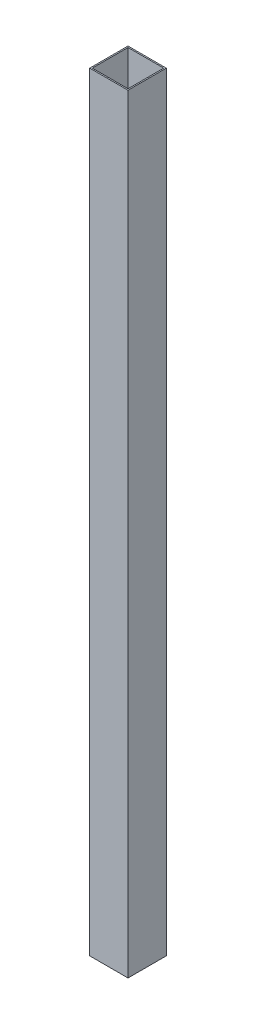
ISO-10303-21;
HEADER;
FILE_DESCRIPTION(('STEP AP214'),'2;1');
FILE_NAME('part.step','',(''),(''),'','','');
FILE_SCHEMA(('AUTOMOTIVE_DESIGN { 1 0 10303 214 1 1 1 1 }'));
ENDSEC;
DATA;
#1=APPLICATION_CONTEXT('core data for automotive mechanical design processes');
#2=APPLICATION_PROTOCOL_DEFINITION('international standard','automotive_design',2000,#1);
#3=PRODUCT_CONTEXT('',#1,'mechanical');
#4=PRODUCT('Part','Part','',(#3));
#5=PRODUCT_RELATED_PRODUCT_CATEGORY('part','',(#4));
#6=PRODUCT_DEFINITION_FORMATION('','',#4);
#7=PRODUCT_DEFINITION_CONTEXT('part definition',#1,'design');
#8=PRODUCT_DEFINITION('design','',#6,#7);
#9=PRODUCT_DEFINITION_SHAPE('','',#8);
#10=(LENGTH_UNIT() NAMED_UNIT(*) SI_UNIT(.MILLI.,.METRE.));
#11=(NAMED_UNIT(*) PLANE_ANGLE_UNIT() SI_UNIT($,.RADIAN.));
#12=(NAMED_UNIT(*) SI_UNIT($,.STERADIAN.) SOLID_ANGLE_UNIT());
#13=UNCERTAINTY_MEASURE_WITH_UNIT(LENGTH_MEASURE(1.E-05),#10,'distance_accuracy_value','');
#14=(GEOMETRIC_REPRESENTATION_CONTEXT(3) GLOBAL_UNCERTAINTY_ASSIGNED_CONTEXT((#13)) GLOBAL_UNIT_ASSIGNED_CONTEXT((#10,
#11,#12)) REPRESENTATION_CONTEXT('',''));
#15=CARTESIAN_POINT('',(0.,0.,0.));
#16=DIRECTION('',(0.,0.,1.));
#17=DIRECTION('',(1.,0.,0.));
#18=AXIS2_PLACEMENT_3D('',#15,#16,#17);
#19=CARTESIAN_POINT('',(1310.,7180.,150.000000000003));
#20=DIRECTION('',(1.,0.,0.));
#21=DIRECTION('',(0.,0.,-1.));
#22=AXIS2_PLACEMENT_3D('',#19,#20,#21);
#23=PLANE('',#22);
#24=DIRECTION('',(0.,-1.,0.));
#25=VECTOR('',#24,1.);
#26=CARTESIAN_POINT('',(1310.,8130.,150.));
#27=LINE('',#26,#25);
#28=CARTESIAN_POINT('',(1310.,8130.,150.));
#29=VERTEX_POINT('',#28);
#30=CARTESIAN_POINT('',(1310.,2107.5,150.));
#31=VERTEX_POINT('',#30);
#32=EDGE_CURVE('E101',#29,#31,#27,.T.);
#33=ORIENTED_EDGE('',*,*,#32,.T.);
#34=DIRECTION('',(0.,0.,1.));
#35=VECTOR('',#34,1.);
#36=CARTESIAN_POINT('',(1310.,2107.5,150.));
#37=LINE('',#36,#35);
#38=CARTESIAN_POINT('',(1310.,2107.5,-150.));
#39=VERTEX_POINT('',#38);
#40=EDGE_CURVE('E103',#39,#31,#37,.T.);
#41=ORIENTED_EDGE('',*,*,#40,.F.);
#42=DIRECTION('',(0.,-1.,0.));
#43=VECTOR('',#42,1.);
#44=CARTESIAN_POINT('',(1310.,8130.,-150.));
#45=LINE('',#44,#43);
#46=CARTESIAN_POINT('',(1310.,8130.,-150.));
#47=VERTEX_POINT('',#46);
#48=EDGE_CURVE('E110',#47,#39,#45,.T.);
#49=ORIENTED_EDGE('',*,*,#48,.F.);
#50=DIRECTION('',(0.,0.,1.));
#51=VECTOR('',#50,1.);
#52=CARTESIAN_POINT('',(1310.,8130.,150.));
#53=LINE('',#52,#51);
#54=EDGE_CURVE('E106',#47,#29,#53,.T.);
#55=ORIENTED_EDGE('',*,*,#54,.T.);
#56=EDGE_LOOP('',(#33,#41,#49,#55));
#57=FACE_BOUND('',#56,.T.);
#58=ADVANCED_FACE('F34',(#57),#23,.T.);
#59=CARTESIAN_POINT('',(1010.,2107.5,150.));
#60=DIRECTION('',(0.,1.,0.));
#61=DIRECTION('',(0.,0.,1.));
#62=AXIS2_PLACEMENT_3D('',#59,#60,#61);
#63=PLANE('',#62);
#64=DIRECTION('',(-1.,0.,0.));
#65=VECTOR('',#64,1.);
#66=CARTESIAN_POINT('',(1020.,2107.5,140.));
#67=LINE('',#66,#65);
#68=CARTESIAN_POINT('',(1300.,2107.5,140.));
#69=VERTEX_POINT('',#68);
#70=CARTESIAN_POINT('',(1020.,2107.5,140.));
#71=VERTEX_POINT('',#70);
#72=EDGE_CURVE('E160',#69,#71,#67,.T.);
#73=ORIENTED_EDGE('',*,*,#72,.F.);
#74=DIRECTION('',(0.,0.,1.));
#75=VECTOR('',#74,1.);
#76=CARTESIAN_POINT('',(1300.,2107.5,140.));
#77=LINE('',#76,#75);
#78=CARTESIAN_POINT('',(1300.,2107.5,-140.));
#79=VERTEX_POINT('',#78);
#80=EDGE_CURVE('E59',#79,#69,#77,.T.);
#81=ORIENTED_EDGE('',*,*,#80,.F.);
#82=DIRECTION('',(1.,0.,0.));
#83=VECTOR('',#82,1.);
#84=CARTESIAN_POINT('',(1020.,2107.5,-140.));
#85=LINE('',#84,#83);
#86=CARTESIAN_POINT('',(1020.,2107.5,-140.));
#87=VERTEX_POINT('',#86);
#88=EDGE_CURVE('E164',#87,#79,#85,.T.);
#89=ORIENTED_EDGE('',*,*,#88,.F.);
#90=DIRECTION('',(0.,0.,-1.));
#91=VECTOR('',#90,1.);
#92=CARTESIAN_POINT('',(1020.,2107.5,140.));
#93=LINE('',#92,#91);
#94=EDGE_CURVE('E51',#71,#87,#93,.T.);
#95=ORIENTED_EDGE('',*,*,#94,.F.);
#96=EDGE_LOOP('',(#73,#81,#89,#95));
#97=FACE_BOUND('',#96,.T.);
#98=ORIENTED_EDGE('',*,*,#40,.T.);
#99=DIRECTION('',(1.,0.,0.));
#100=VECTOR('',#99,1.);
#101=CARTESIAN_POINT('',(160.,2107.5,150.));
#102=LINE('',#101,#100);
#103=CARTESIAN_POINT('',(1010.,2107.5,150.));
#104=VERTEX_POINT('',#103);
#105=EDGE_CURVE('E116',#104,#31,#102,.T.);
#106=ORIENTED_EDGE('',*,*,#105,.F.);
#107=DIRECTION('',(0.,0.,-1.));
#108=VECTOR('',#107,1.);
#109=CARTESIAN_POINT('',(1010.,2107.5,150.));
#110=LINE('',#109,#108);
#111=CARTESIAN_POINT('',(1010.,2107.5,-150.));
#112=VERTEX_POINT('',#111);
#113=EDGE_CURVE('E120',#104,#112,#110,.T.);
#114=ORIENTED_EDGE('',*,*,#113,.T.);
#115=DIRECTION('',(-1.,0.,0.));
#116=VECTOR('',#115,1.);
#117=CARTESIAN_POINT('',(160.,2107.5,-150.));
#118=LINE('',#117,#116);
#119=EDGE_CURVE('E118',#39,#112,#118,.T.);
#120=ORIENTED_EDGE('',*,*,#119,.F.);
#121=EDGE_LOOP('',(#98,#106,#114,#120));
#122=FACE_BOUND('',#121,.T.);
#123=ADVANCED_FACE('F114',(#97,#122),#63,.F.);
#124=CARTESIAN_POINT('',(4550.,8130.,0.));
#125=DIRECTION('',(0.,1.,0.));
#126=DIRECTION('',(0.,0.,1.));
#127=AXIS2_PLACEMENT_3D('',#124,#125,#126);
#128=PLANE('',#127);
#129=DIRECTION('',(0.,0.,-1.));
#130=VECTOR('',#129,1.);
#131=CARTESIAN_POINT('',(1020.,8130.,140.));
#132=LINE('',#131,#130);
#133=CARTESIAN_POINT('',(1020.,8130.,140.));
#134=VERTEX_POINT('',#133);
#135=CARTESIAN_POINT('',(1020.,8130.,-140.));
#136=VERTEX_POINT('',#135);
#137=EDGE_CURVE('E174',#134,#136,#132,.T.);
#138=ORIENTED_EDGE('',*,*,#137,.T.);
#139=DIRECTION('',(1.,0.,0.));
#140=VECTOR('',#139,1.);
#141=CARTESIAN_POINT('',(1020.,8130.,-140.));
#142=LINE('',#141,#140);
#143=CARTESIAN_POINT('',(1300.,8130.,-140.));
#144=VERTEX_POINT('',#143);
#145=EDGE_CURVE('E183',#136,#144,#142,.T.);
#146=ORIENTED_EDGE('',*,*,#145,.T.);
#147=DIRECTION('',(0.,0.,1.));
#148=VECTOR('',#147,1.);
#149=CARTESIAN_POINT('',(1300.,8130.,140.));
#150=LINE('',#149,#148);
#151=CARTESIAN_POINT('',(1300.,8130.,140.));
#152=VERTEX_POINT('',#151);
#153=EDGE_CURVE('E180',#144,#152,#150,.T.);
#154=ORIENTED_EDGE('',*,*,#153,.T.);
#155=DIRECTION('',(-1.,0.,0.));
#156=VECTOR('',#155,1.);
#157=CARTESIAN_POINT('',(1020.,8130.,140.));
#158=LINE('',#157,#156);
#159=EDGE_CURVE('E177',#152,#134,#158,.T.);
#160=ORIENTED_EDGE('',*,*,#159,.T.);
#161=EDGE_LOOP('',(#138,#146,#154,#160));
#162=FACE_BOUND('',#161,.T.);
#163=DIRECTION('',(-1.,0.,0.));
#164=VECTOR('',#163,1.);
#165=CARTESIAN_POINT('',(1010.,8130.,150.));
#166=LINE('',#165,#164);
#167=CARTESIAN_POINT('',(1010.,8130.,150.));
#168=VERTEX_POINT('',#167);
#169=EDGE_CURVE('E38',#29,#168,#166,.T.);
#170=ORIENTED_EDGE('',*,*,#169,.F.);
#171=ORIENTED_EDGE('',*,*,#54,.F.);
#172=DIRECTION('',(1.,0.,0.));
#173=VECTOR('',#172,1.);
#174=CARTESIAN_POINT('',(1010.,8130.,-150.));
#175=LINE('',#174,#173);
#176=CARTESIAN_POINT('',(1010.,8130.,-150.));
#177=VERTEX_POINT('',#176);
#178=EDGE_CURVE('E170',#177,#47,#175,.T.);
#179=ORIENTED_EDGE('',*,*,#178,.F.);
#180=DIRECTION('',(0.,0.,-1.));
#181=VECTOR('',#180,1.);
#182=CARTESIAN_POINT('',(1010.,8130.,150.));
#183=LINE('',#182,#181);
#184=EDGE_CURVE('E167',#168,#177,#183,.T.);
#185=ORIENTED_EDGE('',*,*,#184,.F.);
#186=EDGE_LOOP('',(#170,#171,#179,#185));
#187=FACE_BOUND('',#186,.T.);
#188=ADVANCED_FACE('F206',(#162,#187),#128,.T.);
#189=CARTESIAN_POINT('',(160.,2347.5,-150.));
#190=DIRECTION('',(0.,0.,1.));
#191=DIRECTION('',(1.,0.,0.));
#192=AXIS2_PLACEMENT_3D('',#189,#190,#191);
#193=PLANE('',#192);
#194=ORIENTED_EDGE('',*,*,#178,.T.);
#195=ORIENTED_EDGE('',*,*,#48,.T.);
#196=ORIENTED_EDGE('',*,*,#119,.T.);
#197=DIRECTION('',(0.,-1.,0.));
#198=VECTOR('',#197,1.);
#199=CARTESIAN_POINT('',(1010.,2347.5,-150.));
#200=LINE('',#199,#198);
#201=EDGE_CURVE('E43',#177,#112,#200,.T.);
#202=ORIENTED_EDGE('',*,*,#201,.F.);
#203=EDGE_LOOP('',(#194,#195,#196,#202));
#204=FACE_BOUND('',#203,.T.);
#205=ADVANCED_FACE('F36',(#204),#193,.F.);
#206=CARTESIAN_POINT('',(160.,2347.5,150.));
#207=DIRECTION('',(0.,0.,-1.));
#208=DIRECTION('',(-1.,0.,0.));
#209=AXIS2_PLACEMENT_3D('',#206,#207,#208);
#210=PLANE('',#209);
#211=ORIENTED_EDGE('',*,*,#32,.F.);
#212=ORIENTED_EDGE('',*,*,#169,.T.);
#213=DIRECTION('',(0.,1.,0.));
#214=VECTOR('',#213,1.);
#215=CARTESIAN_POINT('',(1010.,2347.5,150.));
#216=LINE('',#215,#214);
#217=EDGE_CURVE('E11',#104,#168,#216,.T.);
#218=ORIENTED_EDGE('',*,*,#217,.F.);
#219=ORIENTED_EDGE('',*,*,#105,.T.);
#220=EDGE_LOOP('',(#211,#212,#218,#219));
#221=FACE_BOUND('',#220,.T.);
#222=ADVANCED_FACE('F123',(#221),#210,.F.);
#223=CARTESIAN_POINT('',(1300.,8130.,140.));
#224=DIRECTION('',(-1.,0.,0.));
#225=DIRECTION('',(0.,0.,-1.));
#226=AXIS2_PLACEMENT_3D('',#223,#224,#225);
#227=PLANE('',#226);
#228=ORIENTED_EDGE('',*,*,#80,.T.);
#229=DIRECTION('',(0.,-1.,0.));
#230=VECTOR('',#229,1.);
#231=CARTESIAN_POINT('',(1300.,8130.,140.));
#232=LINE('',#231,#230);
#233=EDGE_CURVE('E111',#152,#69,#232,.T.);
#234=ORIENTED_EDGE('',*,*,#233,.F.);
#235=ORIENTED_EDGE('',*,*,#153,.F.);
#236=DIRECTION('',(0.,-1.,0.));
#237=VECTOR('',#236,1.);
#238=CARTESIAN_POINT('',(1300.,8130.,-140.));
#239=LINE('',#238,#237);
#240=EDGE_CURVE('E189',#144,#79,#239,.T.);
#241=ORIENTED_EDGE('',*,*,#240,.T.);
#242=EDGE_LOOP('',(#228,#234,#235,#241));
#243=FACE_BOUND('',#242,.T.);
#244=ADVANCED_FACE('F218',(#243),#227,.T.);
#245=CARTESIAN_POINT('',(1020.,8130.,-140.));
#246=DIRECTION('',(0.,0.,1.));
#247=DIRECTION('',(-1.,0.,0.));
#248=AXIS2_PLACEMENT_3D('',#245,#246,#247);
#249=PLANE('',#248);
#250=ORIENTED_EDGE('',*,*,#88,.T.);
#251=ORIENTED_EDGE('',*,*,#240,.F.);
#252=ORIENTED_EDGE('',*,*,#145,.F.);
#253=DIRECTION('',(0.,-1.,0.));
#254=VECTOR('',#253,1.);
#255=CARTESIAN_POINT('',(1020.,0.,-140.));
#256=LINE('',#255,#254);
#257=EDGE_CURVE('E125',#136,#87,#256,.T.);
#258=ORIENTED_EDGE('',*,*,#257,.T.);
#259=EDGE_LOOP('',(#250,#251,#252,#258));
#260=FACE_BOUND('',#259,.T.);
#261=ADVANCED_FACE('F222',(#260),#249,.T.);
#262=CARTESIAN_POINT('',(1020.,8130.,140.));
#263=DIRECTION('',(0.,0.,-1.));
#264=DIRECTION('',(1.,0.,0.));
#265=AXIS2_PLACEMENT_3D('',#262,#263,#264);
#266=PLANE('',#265);
#267=ORIENTED_EDGE('',*,*,#72,.T.);
#268=DIRECTION('',(0.,1.,0.));
#269=VECTOR('',#268,1.);
#270=CARTESIAN_POINT('',(1020.,0.,140.));
#271=LINE('',#270,#269);
#272=EDGE_CURVE('E124',#71,#134,#271,.T.);
#273=ORIENTED_EDGE('',*,*,#272,.T.);
#274=ORIENTED_EDGE('',*,*,#159,.F.);
#275=ORIENTED_EDGE('',*,*,#233,.T.);
#276=EDGE_LOOP('',(#267,#273,#274,#275));
#277=FACE_BOUND('',#276,.T.);
#278=ADVANCED_FACE('F236',(#277),#266,.T.);
#279=CARTESIAN_POINT('',(1010.,2577.5,100.));
#280=DIRECTION('',(-1.,0.,0.));
#281=DIRECTION('',(0.,0.,1.));
#282=AXIS2_PLACEMENT_3D('',#279,#280,#281);
#283=CYLINDRICAL_SURFACE('',#282,12.5000000000002);
#284=CARTESIAN_POINT('',(1020.,2577.5,100.));
#285=DIRECTION('',(1.,0.,0.));
#286=DIRECTION('',(0.,0.,-1.));
#287=AXIS2_PLACEMENT_3D('',#284,#285,#286);
#288=CIRCLE('',#287,12.5000000000002);
#289=CARTESIAN_POINT('',(1020.,2577.5,87.4999999999998));
#290=VERTEX_POINT('',#289);
#291=EDGE_CURVE('E158',#290,#290,#288,.T.);
#292=ORIENTED_EDGE('',*,*,#291,.T.);
#293=EDGE_LOOP('',(#292));
#294=FACE_BOUND('',#293,.T.);
#295=CARTESIAN_POINT('',(1010.,2577.5,100.));
#296=DIRECTION('',(-1.,0.,0.));
#297=DIRECTION('',(0.,0.,1.));
#298=AXIS2_PLACEMENT_3D('',#295,#296,#297);
#299=CIRCLE('',#298,12.5000000000002);
#300=CARTESIAN_POINT('',(1010.,2577.5,112.5));
#301=VERTEX_POINT('',#300);
#302=EDGE_CURVE('E155',#301,#301,#299,.T.);
#303=ORIENTED_EDGE('',*,*,#302,.T.);
#304=EDGE_LOOP('',(#303));
#305=FACE_BOUND('',#304,.T.);
#306=ADVANCED_FACE('F240',(#294,#305),#283,.F.);
#307=CARTESIAN_POINT('',(1010.,2577.5,-100.));
#308=DIRECTION('',(-1.,0.,0.));
#309=DIRECTION('',(0.,0.,1.));
#310=AXIS2_PLACEMENT_3D('',#307,#308,#309);
#311=CYLINDRICAL_SURFACE('',#310,12.5000000000002);
#312=CARTESIAN_POINT('',(1020.,2577.5,-100.));
#313=DIRECTION('',(1.,0.,0.));
#314=DIRECTION('',(0.,0.,-1.));
#315=AXIS2_PLACEMENT_3D('',#312,#313,#314);
#316=CIRCLE('',#315,12.5000000000002);
#317=CARTESIAN_POINT('',(1020.,2577.5,-112.5));
#318=VERTEX_POINT('',#317);
#319=EDGE_CURVE('E152',#318,#318,#316,.T.);
#320=ORIENTED_EDGE('',*,*,#319,.T.);
#321=EDGE_LOOP('',(#320));
#322=FACE_BOUND('',#321,.T.);
#323=CARTESIAN_POINT('',(1010.,2577.5,-100.));
#324=DIRECTION('',(-1.,0.,0.));
#325=DIRECTION('',(0.,0.,1.));
#326=AXIS2_PLACEMENT_3D('',#323,#324,#325);
#327=CIRCLE('',#326,12.5000000000002);
#328=CARTESIAN_POINT('',(1010.,2577.5,-87.4999999999998));
#329=VERTEX_POINT('',#328);
#330=EDGE_CURVE('E149',#329,#329,#327,.T.);
#331=ORIENTED_EDGE('',*,*,#330,.T.);
#332=EDGE_LOOP('',(#331));
#333=FACE_BOUND('',#332,.T.);
#334=ADVANCED_FACE('F244',(#322,#333),#311,.F.);
#335=CARTESIAN_POINT('',(1010.,2527.5,100.));
#336=DIRECTION('',(-1.,0.,0.));
#337=DIRECTION('',(0.,0.,1.));
#338=AXIS2_PLACEMENT_3D('',#335,#336,#337);
#339=CYLINDRICAL_SURFACE('',#338,12.5000000000002);
#340=CARTESIAN_POINT('',(1020.,2527.5,100.));
#341=DIRECTION('',(1.,0.,0.));
#342=DIRECTION('',(0.,0.,-1.));
#343=AXIS2_PLACEMENT_3D('',#340,#341,#342);
#344=CIRCLE('',#343,12.5000000000002);
#345=CARTESIAN_POINT('',(1020.,2527.5,87.4999999999998));
#346=VERTEX_POINT('',#345);
#347=EDGE_CURVE('E148',#346,#346,#344,.T.);
#348=ORIENTED_EDGE('',*,*,#347,.T.);
#349=EDGE_LOOP('',(#348));
#350=FACE_BOUND('',#349,.T.);
#351=CARTESIAN_POINT('',(1010.,2527.5,100.));
#352=DIRECTION('',(-1.,0.,0.));
#353=DIRECTION('',(0.,0.,1.));
#354=AXIS2_PLACEMENT_3D('',#351,#352,#353);
#355=CIRCLE('',#354,12.5000000000002);
#356=CARTESIAN_POINT('',(1010.,2527.5,112.5));
#357=VERTEX_POINT('',#356);
#358=EDGE_CURVE('E145',#357,#357,#355,.T.);
#359=ORIENTED_EDGE('',*,*,#358,.T.);
#360=EDGE_LOOP('',(#359));
#361=FACE_BOUND('',#360,.T.);
#362=ADVANCED_FACE('F248',(#350,#361),#339,.F.);
#363=CARTESIAN_POINT('',(1010.,2527.5,-100.));
#364=DIRECTION('',(-1.,0.,0.));
#365=DIRECTION('',(0.,0.,1.));
#366=AXIS2_PLACEMENT_3D('',#363,#364,#365);
#367=CYLINDRICAL_SURFACE('',#366,12.5000000000002);
#368=CARTESIAN_POINT('',(1020.,2527.5,-100.));
#369=DIRECTION('',(1.,0.,0.));
#370=DIRECTION('',(0.,0.,-1.));
#371=AXIS2_PLACEMENT_3D('',#368,#369,#370);
#372=CIRCLE('',#371,12.5000000000002);
#373=CARTESIAN_POINT('',(1020.,2527.5,-112.5));
#374=VERTEX_POINT('',#373);
#375=EDGE_CURVE('E142',#374,#374,#372,.T.);
#376=ORIENTED_EDGE('',*,*,#375,.T.);
#377=EDGE_LOOP('',(#376));
#378=FACE_BOUND('',#377,.T.);
#379=CARTESIAN_POINT('',(1010.,2527.5,-100.));
#380=DIRECTION('',(-1.,0.,0.));
#381=DIRECTION('',(0.,0.,1.));
#382=AXIS2_PLACEMENT_3D('',#379,#380,#381);
#383=CIRCLE('',#382,12.5000000000002);
#384=CARTESIAN_POINT('',(1010.,2527.5,-87.4999999999998));
#385=VERTEX_POINT('',#384);
#386=EDGE_CURVE('E139',#385,#385,#383,.T.);
#387=ORIENTED_EDGE('',*,*,#386,.T.);
#388=EDGE_LOOP('',(#387));
#389=FACE_BOUND('',#388,.T.);
#390=ADVANCED_FACE('F252',(#378,#389),#367,.F.);
#391=CARTESIAN_POINT('',(1010.,2477.5,100.));
#392=DIRECTION('',(-1.,0.,0.));
#393=DIRECTION('',(0.,0.,1.));
#394=AXIS2_PLACEMENT_3D('',#391,#392,#393);
#395=CYLINDRICAL_SURFACE('',#394,12.5000000000002);
#396=CARTESIAN_POINT('',(1020.,2477.5,100.));
#397=DIRECTION('',(1.,0.,0.));
#398=DIRECTION('',(0.,0.,-1.));
#399=AXIS2_PLACEMENT_3D('',#396,#397,#398);
#400=CIRCLE('',#399,12.5000000000002);
#401=CARTESIAN_POINT('',(1020.,2477.5,87.4999999999998));
#402=VERTEX_POINT('',#401);
#403=EDGE_CURVE('E136',#402,#402,#400,.T.);
#404=ORIENTED_EDGE('',*,*,#403,.T.);
#405=EDGE_LOOP('',(#404));
#406=FACE_BOUND('',#405,.T.);
#407=CARTESIAN_POINT('',(1010.,2477.5,100.));
#408=DIRECTION('',(-1.,0.,0.));
#409=DIRECTION('',(0.,0.,1.));
#410=AXIS2_PLACEMENT_3D('',#407,#408,#409);
#411=CIRCLE('',#410,12.5000000000002);
#412=CARTESIAN_POINT('',(1010.,2477.5,112.5));
#413=VERTEX_POINT('',#412);
#414=EDGE_CURVE('E133',#413,#413,#411,.T.);
#415=ORIENTED_EDGE('',*,*,#414,.T.);
#416=EDGE_LOOP('',(#415));
#417=FACE_BOUND('',#416,.T.);
#418=ADVANCED_FACE('F256',(#406,#417),#395,.F.);
#419=CARTESIAN_POINT('',(1010.,2477.5,-100.));
#420=DIRECTION('',(-1.,0.,0.));
#421=DIRECTION('',(0.,0.,1.));
#422=AXIS2_PLACEMENT_3D('',#419,#420,#421);
#423=CYLINDRICAL_SURFACE('',#422,12.5000000000002);
#424=CARTESIAN_POINT('',(1020.,2477.5,-100.));
#425=DIRECTION('',(1.,0.,0.));
#426=DIRECTION('',(0.,0.,-1.));
#427=AXIS2_PLACEMENT_3D('',#424,#425,#426);
#428=CIRCLE('',#427,12.5000000000002);
#429=CARTESIAN_POINT('',(1020.,2477.5,-112.5));
#430=VERTEX_POINT('',#429);
#431=EDGE_CURVE('E132',#430,#430,#428,.T.);
#432=ORIENTED_EDGE('',*,*,#431,.T.);
#433=EDGE_LOOP('',(#432));
#434=FACE_BOUND('',#433,.T.);
#435=CARTESIAN_POINT('',(1010.,2477.5,-100.));
#436=DIRECTION('',(-1.,0.,0.));
#437=DIRECTION('',(0.,0.,1.));
#438=AXIS2_PLACEMENT_3D('',#435,#436,#437);
#439=CIRCLE('',#438,12.5000000000002);
#440=CARTESIAN_POINT('',(1010.,2477.5,-87.4999999999998));
#441=VERTEX_POINT('',#440);
#442=EDGE_CURVE('E129',#441,#441,#439,.T.);
#443=ORIENTED_EDGE('',*,*,#442,.T.);
#444=EDGE_LOOP('',(#443));
#445=FACE_BOUND('',#444,.T.);
#446=ADVANCED_FACE('F230',(#434,#445),#423,.F.);
#447=CARTESIAN_POINT('',(1020.,0.,0.));
#448=DIRECTION('',(1.,0.,0.));
#449=DIRECTION('',(0.,0.,-1.));
#450=AXIS2_PLACEMENT_3D('',#447,#448,#449);
#451=PLANE('',#450);
#452=ORIENTED_EDGE('',*,*,#431,.F.);
#453=EDGE_LOOP('',(#452));
#454=FACE_BOUND('',#453,.T.);
#455=ORIENTED_EDGE('',*,*,#403,.F.);
#456=EDGE_LOOP('',(#455));
#457=FACE_BOUND('',#456,.T.);
#458=ORIENTED_EDGE('',*,*,#375,.F.);
#459=EDGE_LOOP('',(#458));
#460=FACE_BOUND('',#459,.T.);
#461=ORIENTED_EDGE('',*,*,#347,.F.);
#462=EDGE_LOOP('',(#461));
#463=FACE_BOUND('',#462,.T.);
#464=ORIENTED_EDGE('',*,*,#319,.F.);
#465=EDGE_LOOP('',(#464));
#466=FACE_BOUND('',#465,.T.);
#467=ORIENTED_EDGE('',*,*,#291,.F.);
#468=EDGE_LOOP('',(#467));
#469=FACE_BOUND('',#468,.T.);
#470=ORIENTED_EDGE('',*,*,#272,.F.);
#471=ORIENTED_EDGE('',*,*,#94,.T.);
#472=ORIENTED_EDGE('',*,*,#257,.F.);
#473=ORIENTED_EDGE('',*,*,#137,.F.);
#474=EDGE_LOOP('',(#470,#471,#472,#473));
#475=FACE_BOUND('',#474,.T.);
#476=ADVANCED_FACE('F225',(#454,#457,#460,#463,#466,#469,#475),#451,.T.);
#477=CARTESIAN_POINT('',(1010.,2667.5,150.));
#478=DIRECTION('',(-1.,0.,0.));
#479=DIRECTION('',(0.,0.,1.));
#480=AXIS2_PLACEMENT_3D('',#477,#478,#479);
#481=PLANE('',#480);
#482=ORIENTED_EDGE('',*,*,#184,.T.);
#483=ORIENTED_EDGE('',*,*,#201,.T.);
#484=ORIENTED_EDGE('',*,*,#113,.F.);
#485=ORIENTED_EDGE('',*,*,#217,.T.);
#486=EDGE_LOOP('',(#482,#483,#484,#485));
#487=FACE_BOUND('',#486,.T.);
#488=ORIENTED_EDGE('',*,*,#442,.F.);
#489=EDGE_LOOP('',(#488));
#490=FACE_BOUND('',#489,.T.);
#491=ORIENTED_EDGE('',*,*,#386,.F.);
#492=EDGE_LOOP('',(#491));
#493=FACE_BOUND('',#492,.T.);
#494=ORIENTED_EDGE('',*,*,#330,.F.);
#495=EDGE_LOOP('',(#494));
#496=FACE_BOUND('',#495,.T.);
#497=ORIENTED_EDGE('',*,*,#414,.F.);
#498=EDGE_LOOP('',(#497));
#499=FACE_BOUND('',#498,.T.);
#500=ORIENTED_EDGE('',*,*,#358,.F.);
#501=EDGE_LOOP('',(#500));
#502=FACE_BOUND('',#501,.T.);
#503=ORIENTED_EDGE('',*,*,#302,.F.);
#504=EDGE_LOOP('',(#503));
#505=FACE_BOUND('',#504,.T.);
#506=ADVANCED_FACE('F200',(#487,#490,#493,#496,#499,#502,#505),#481,.T.);
#507=CLOSED_SHELL('',(#58,#123,#188,#205,#222,#244,#261,#278,#306,#334,#362,#390,#418,#446,#476,#506));
#508=MANIFOLD_SOLID_BREP('B2',#507);
#509=ADVANCED_BREP_SHAPE_REPRESENTATION('',(#18,#508),#14);
#510=SHAPE_DEFINITION_REPRESENTATION(#9,#509);
ENDSEC;
END-ISO-10303-21;
